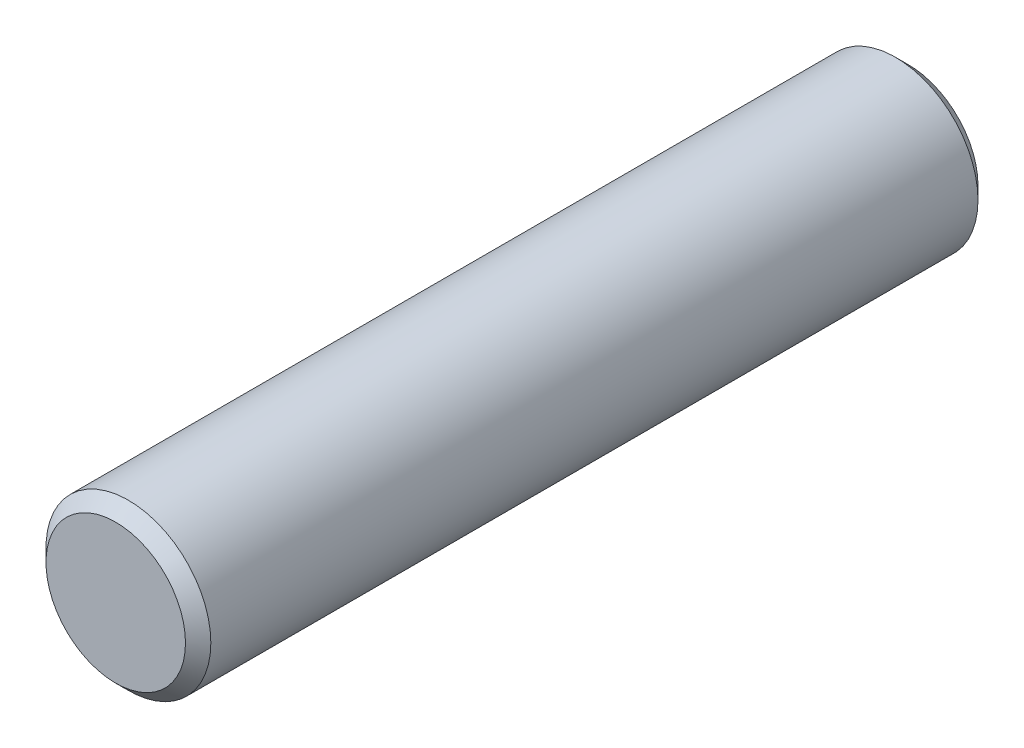
ISO-10303-21;
HEADER;
FILE_DESCRIPTION(('STEP AP214'),'2;1');
FILE_NAME('part.step','',(''),(''),'','','');
FILE_SCHEMA(('AUTOMOTIVE_DESIGN { 1 0 10303 214 1 1 1 1 }'));
ENDSEC;
DATA;
#1=APPLICATION_CONTEXT('core data for automotive mechanical design processes');
#2=APPLICATION_PROTOCOL_DEFINITION('international standard','automotive_design',2000,#1);
#3=PRODUCT_CONTEXT('',#1,'mechanical');
#4=PRODUCT('Part','Part','',(#3));
#5=PRODUCT_RELATED_PRODUCT_CATEGORY('part','',(#4));
#6=PRODUCT_DEFINITION_FORMATION('','',#4);
#7=PRODUCT_DEFINITION_CONTEXT('part definition',#1,'design');
#8=PRODUCT_DEFINITION('design','',#6,#7);
#9=PRODUCT_DEFINITION_SHAPE('','',#8);
#10=(LENGTH_UNIT() NAMED_UNIT(*) SI_UNIT(.MILLI.,.METRE.));
#11=(NAMED_UNIT(*) PLANE_ANGLE_UNIT() SI_UNIT($,.RADIAN.));
#12=(NAMED_UNIT(*) SI_UNIT($,.STERADIAN.) SOLID_ANGLE_UNIT());
#13=UNCERTAINTY_MEASURE_WITH_UNIT(LENGTH_MEASURE(1.E-05),#10,'distance_accuracy_value','');
#14=(GEOMETRIC_REPRESENTATION_CONTEXT(3) GLOBAL_UNCERTAINTY_ASSIGNED_CONTEXT((#13)) GLOBAL_UNIT_ASSIGNED_CONTEXT((#10,
#11,#12)) REPRESENTATION_CONTEXT('',''));
#15=CARTESIAN_POINT('',(0.,0.,0.));
#16=DIRECTION('',(0.,0.,1.));
#17=DIRECTION('',(1.,0.,0.));
#18=AXIS2_PLACEMENT_3D('',#15,#16,#17);
#19=CARTESIAN_POINT('',(0.,0.,15.875));
#20=DIRECTION('',(0.,0.,-1.));
#21=DIRECTION('',(-1.,0.,0.));
#22=AXIS2_PLACEMENT_3D('',#19,#20,#21);
#23=CYLINDRICAL_SURFACE('',#22,1.651);
#24=CARTESIAN_POINT('',(0.,0.,0.254000000000003));
#25=DIRECTION('',(0.,0.,1.));
#26=DIRECTION('',(1.,0.,0.));
#27=AXIS2_PLACEMENT_3D('',#24,#25,#26);
#28=CIRCLE('',#27,1.651);
#29=CARTESIAN_POINT('',(1.651,0.,0.254000000000003));
#30=VERTEX_POINT('',#29);
#31=EDGE_CURVE('E47',#30,#30,#28,.T.);
#32=ORIENTED_EDGE('',*,*,#31,.T.);
#33=EDGE_LOOP('',(#32));
#34=FACE_BOUND('',#33,.T.);
#35=CARTESIAN_POINT('',(0.,0.,15.621));
#36=DIRECTION('',(0.,0.,1.));
#37=DIRECTION('',(1.,0.,0.));
#38=AXIS2_PLACEMENT_3D('',#35,#36,#37);
#39=CIRCLE('',#38,1.651);
#40=CARTESIAN_POINT('',(1.651,0.,15.621));
#41=VERTEX_POINT('',#40);
#42=EDGE_CURVE('E51',#41,#41,#39,.F.);
#43=ORIENTED_EDGE('',*,*,#42,.T.);
#44=EDGE_LOOP('',(#43));
#45=FACE_BOUND('',#44,.T.);
#46=ADVANCED_FACE('F35',(#34,#45),#23,.T.);
#47=CARTESIAN_POINT('',(0.,0.,15.875));
#48=DIRECTION('',(0.,0.,1.));
#49=DIRECTION('',(1.,0.,0.));
#50=AXIS2_PLACEMENT_3D('',#47,#48,#49);
#51=PLANE('',#50);
#52=CARTESIAN_POINT('',(0.,0.,15.875));
#53=DIRECTION('',(0.,0.,1.));
#54=DIRECTION('',(1.,0.,0.));
#55=AXIS2_PLACEMENT_3D('',#52,#53,#54);
#56=CIRCLE('',#55,1.397);
#57=CARTESIAN_POINT('',(1.397,0.,15.875));
#58=VERTEX_POINT('',#57);
#59=EDGE_CURVE('E10',#58,#58,#56,.T.);
#60=ORIENTED_EDGE('',*,*,#59,.T.);
#61=EDGE_LOOP('',(#60));
#62=FACE_BOUND('',#61,.T.);
#63=ADVANCED_FACE('F67',(#62),#51,.T.);
#64=CARTESIAN_POINT('',(0.,0.,0.));
#65=DIRECTION('',(0.,0.,1.));
#66=DIRECTION('',(1.,0.,0.));
#67=AXIS2_PLACEMENT_3D('',#64,#65,#66);
#68=PLANE('',#67);
#69=CARTESIAN_POINT('',(0.,0.,0.));
#70=DIRECTION('',(0.,0.,1.));
#71=DIRECTION('',(1.,0.,0.));
#72=AXIS2_PLACEMENT_3D('',#69,#70,#71);
#73=CIRCLE('',#72,1.397);
#74=CARTESIAN_POINT('',(1.397,0.,0.));
#75=VERTEX_POINT('',#74);
#76=EDGE_CURVE('E43',#75,#75,#73,.F.);
#77=ORIENTED_EDGE('',*,*,#76,.T.);
#78=EDGE_LOOP('',(#77));
#79=FACE_BOUND('',#78,.T.);
#80=ADVANCED_FACE('F64',(#79),#68,.F.);
#81=CARTESIAN_POINT('',(0.,0.,0.254000000000003));
#82=DIRECTION('',(0.,0.,1.));
#83=DIRECTION('',(1.,0.,0.));
#84=AXIS2_PLACEMENT_3D('',#81,#82,#83);
#85=CONICAL_SURFACE('',#84,1.651,0.785398163397452);
#86=ORIENTED_EDGE('',*,*,#76,.F.);
#87=EDGE_LOOP('',(#86));
#88=FACE_BOUND('',#87,.T.);
#89=ORIENTED_EDGE('',*,*,#31,.F.);
#90=EDGE_LOOP('',(#89));
#91=FACE_BOUND('',#90,.T.);
#92=ADVANCED_FACE('F60',(#88,#91),#85,.T.);
#93=CARTESIAN_POINT('',(0.,0.,15.875));
#94=DIRECTION('',(0.,0.,-1.));
#95=DIRECTION('',(-1.,0.,0.));
#96=AXIS2_PLACEMENT_3D('',#93,#94,#95);
#97=CONICAL_SURFACE('',#96,1.397,0.785398163397445);
#98=ORIENTED_EDGE('',*,*,#42,.F.);
#99=EDGE_LOOP('',(#98));
#100=FACE_BOUND('',#99,.T.);
#101=ORIENTED_EDGE('',*,*,#59,.F.);
#102=EDGE_LOOP('',(#101));
#103=FACE_BOUND('',#102,.T.);
#104=ADVANCED_FACE('F38',(#100,#103),#97,.T.);
#105=CLOSED_SHELL('',(#46,#63,#80,#92,#104));
#106=MANIFOLD_SOLID_BREP('B2',#105);
#107=ADVANCED_BREP_SHAPE_REPRESENTATION('',(#18,#106),#14);
#108=SHAPE_DEFINITION_REPRESENTATION(#9,#107);
ENDSEC;
END-ISO-10303-21;
